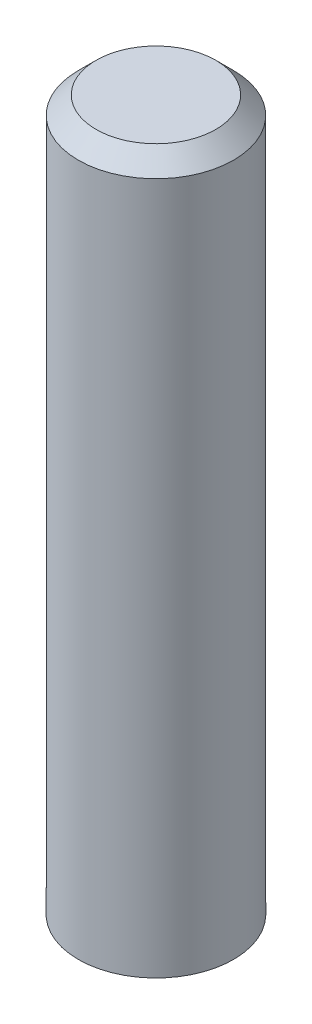
ISO-10303-21;
HEADER;
FILE_DESCRIPTION(('STEP AP214'),'2;1');
FILE_NAME('part.step','',(''),(''),'','','');
FILE_SCHEMA(('AUTOMOTIVE_DESIGN { 1 0 10303 214 1 1 1 1 }'));
ENDSEC;
DATA;
#1=APPLICATION_CONTEXT('core data for automotive mechanical design processes');
#2=APPLICATION_PROTOCOL_DEFINITION('international standard','automotive_design',2000,#1);
#3=PRODUCT_CONTEXT('',#1,'mechanical');
#4=PRODUCT('Part','Part','',(#3));
#5=PRODUCT_RELATED_PRODUCT_CATEGORY('part','',(#4));
#6=PRODUCT_DEFINITION_FORMATION('','',#4);
#7=PRODUCT_DEFINITION_CONTEXT('part definition',#1,'design');
#8=PRODUCT_DEFINITION('design','',#6,#7);
#9=PRODUCT_DEFINITION_SHAPE('','',#8);
#10=(LENGTH_UNIT() NAMED_UNIT(*) SI_UNIT(.MILLI.,.METRE.));
#11=(NAMED_UNIT(*) PLANE_ANGLE_UNIT() SI_UNIT($,.RADIAN.));
#12=(NAMED_UNIT(*) SI_UNIT($,.STERADIAN.) SOLID_ANGLE_UNIT());
#13=UNCERTAINTY_MEASURE_WITH_UNIT(LENGTH_MEASURE(1.E-05),#10,'distance_accuracy_value','');
#14=(GEOMETRIC_REPRESENTATION_CONTEXT(3) GLOBAL_UNCERTAINTY_ASSIGNED_CONTEXT((#13)) GLOBAL_UNIT_ASSIGNED_CONTEXT((#10,
#11,#12)) REPRESENTATION_CONTEXT('',''));
#15=CARTESIAN_POINT('',(0.,0.,0.));
#16=DIRECTION('',(0.,0.,1.));
#17=DIRECTION('',(1.,0.,0.));
#18=AXIS2_PLACEMENT_3D('',#15,#16,#17);
#19=CARTESIAN_POINT('',(0.,15.3162000000293,0.));
#20=DIRECTION('',(0.,-1.,0.));
#21=DIRECTION('',(0.,0.,-1.));
#22=AXIS2_PLACEMENT_3D('',#19,#20,#21);
#23=CONICAL_SURFACE('',#22,2.55269999991015,1.02974425853382);
#24=CARTESIAN_POINT('',(0.,15.3162,0.));
#25=DIRECTION('',(0.,-1.,0.));
#26=DIRECTION('',(0.,0.,-1.));
#27=AXIS2_PLACEMENT_3D('',#24,#25,#26);
#28=CIRCLE('',#27,2.5527);
#29=CARTESIAN_POINT('',(0.,15.3162,-2.5527));
#30=VERTEX_POINT('',#29);
#31=EDGE_CURVE('E65',#30,#30,#28,.T.);
#32=ORIENTED_EDGE('',*,*,#31,.T.);
#33=EDGE_LOOP('',(#32));
#34=FACE_BOUND('',#33,.T.);
#35=CARTESIAN_POINT('',(-1.4210854715202E-10,16.8500169022821,0.));
#36=VERTEX_POINT('',#35);
#37=VERTEX_LOOP('',#36);
#38=FACE_BOUND('',#37,.T.);
#39=ADVANCED_FACE('F17',(#34,#38),#23,.F.);
#40=CARTESIAN_POINT('',(0.,17.6925177473017,0.));
#41=DIRECTION('',(0.,-1.,0.));
#42=DIRECTION('',(0.,0.,-1.));
#43=AXIS2_PLACEMENT_3D('',#40,#41,#42);
#44=CYLINDRICAL_SURFACE('',#43,2.5527);
#45=ORIENTED_EDGE('',*,*,#31,.F.);
#46=EDGE_LOOP('',(#45));
#47=FACE_BOUND('',#46,.T.);
#48=CARTESIAN_POINT('',(0.,0.,0.));
#49=DIRECTION('',(0.,-1.,0.));
#50=DIRECTION('',(0.,0.,-1.));
#51=AXIS2_PLACEMENT_3D('',#48,#49,#50);
#52=CIRCLE('',#51,2.5527);
#53=CARTESIAN_POINT('',(0.,0.,-2.5527));
#54=VERTEX_POINT('',#53);
#55=EDGE_CURVE('E20',#54,#54,#52,.T.);
#56=ORIENTED_EDGE('',*,*,#55,.T.);
#57=EDGE_LOOP('',(#56));
#58=FACE_BOUND('',#57,.T.);
#59=ADVANCED_FACE('F29',(#47,#58),#44,.F.);
#60=CARTESIAN_POINT('',(0.,101.6,0.));
#61=DIRECTION('',(0.,1.,0.));
#62=DIRECTION('',(0.,0.,1.));
#63=AXIS2_PLACEMENT_3D('',#60,#61,#62);
#64=PLANE('',#63);
#65=CARTESIAN_POINT('',(0.,101.6,0.));
#66=DIRECTION('',(0.,-1.,0.));
#67=DIRECTION('',(0.,0.,-1.));
#68=AXIS2_PLACEMENT_3D('',#65,#66,#67);
#69=CIRCLE('',#68,8.57250000000527);
#70=CARTESIAN_POINT('',(0.,101.6,-8.57250000000527));
#71=VERTEX_POINT('',#70);
#72=EDGE_CURVE('E61',#71,#71,#69,.T.);
#73=ORIENTED_EDGE('',*,*,#72,.F.);
#74=EDGE_LOOP('',(#73));
#75=FACE_BOUND('',#74,.T.);
#76=ADVANCED_FACE('F35',(#75),#64,.T.);
#77=CARTESIAN_POINT('',(0.,0.,0.));
#78=DIRECTION('',(0.,1.,0.));
#79=DIRECTION('',(0.,0.,1.));
#80=AXIS2_PLACEMENT_3D('',#77,#78,#79);
#81=PLANE('',#80);
#82=ORIENTED_EDGE('',*,*,#55,.F.);
#83=EDGE_LOOP('',(#82));
#84=FACE_BOUND('',#83,.T.);
#85=CARTESIAN_POINT('',(0.,0.,0.));
#86=DIRECTION('',(0.,1.,0.));
#87=DIRECTION('',(0.,0.,1.));
#88=AXIS2_PLACEMENT_3D('',#85,#86,#87);
#89=CIRCLE('',#88,11.1125);
#90=CARTESIAN_POINT('',(0.,0.,11.1125));
#91=VERTEX_POINT('',#90);
#92=EDGE_CURVE('E24',#91,#91,#89,.T.);
#93=ORIENTED_EDGE('',*,*,#92,.F.);
#94=EDGE_LOOP('',(#93));
#95=FACE_BOUND('',#94,.T.);
#96=ADVANCED_FACE('F46',(#84,#95),#81,.F.);
#97=CARTESIAN_POINT('',(0.,99.0599999999998,0.));
#98=DIRECTION('',(0.,-1.,0.));
#99=DIRECTION('',(0.,0.,-1.));
#100=AXIS2_PLACEMENT_3D('',#97,#98,#99);
#101=CONICAL_SURFACE('',#100,11.1125000000049,0.7853981633973);
#102=CARTESIAN_POINT('',(0.,99.06,0.));
#103=DIRECTION('',(0.,1.,0.));
#104=DIRECTION('',(0.,0.,1.));
#105=AXIS2_PLACEMENT_3D('',#102,#103,#104);
#106=CIRCLE('',#105,11.1125);
#107=CARTESIAN_POINT('',(0.,99.06,11.1125));
#108=VERTEX_POINT('',#107);
#109=EDGE_CURVE('E11',#108,#108,#106,.F.);
#110=ORIENTED_EDGE('',*,*,#109,.F.);
#111=EDGE_LOOP('',(#110));
#112=FACE_BOUND('',#111,.T.);
#113=ORIENTED_EDGE('',*,*,#72,.T.);
#114=EDGE_LOOP('',(#113));
#115=FACE_BOUND('',#114,.T.);
#116=ADVANCED_FACE('F40',(#112,#115),#101,.T.);
#117=CARTESIAN_POINT('',(0.,0.,0.));
#118=DIRECTION('',(0.,1.,0.));
#119=DIRECTION('',(0.,0.,1.));
#120=AXIS2_PLACEMENT_3D('',#117,#118,#119);
#121=CYLINDRICAL_SURFACE('',#120,11.1125);
#122=ORIENTED_EDGE('',*,*,#92,.T.);
#123=EDGE_LOOP('',(#122));
#124=FACE_BOUND('',#123,.T.);
#125=ORIENTED_EDGE('',*,*,#109,.T.);
#126=EDGE_LOOP('',(#125));
#127=FACE_BOUND('',#126,.T.);
#128=ADVANCED_FACE('F38',(#124,#127),#121,.T.);
#129=CLOSED_SHELL('',(#39,#59,#76,#96,#116,#128));
#130=MANIFOLD_SOLID_BREP('B1',#129);
#131=ADVANCED_BREP_SHAPE_REPRESENTATION('',(#18,#130),#14);
#132=SHAPE_DEFINITION_REPRESENTATION(#9,#131);
ENDSEC;
END-ISO-10303-21;
